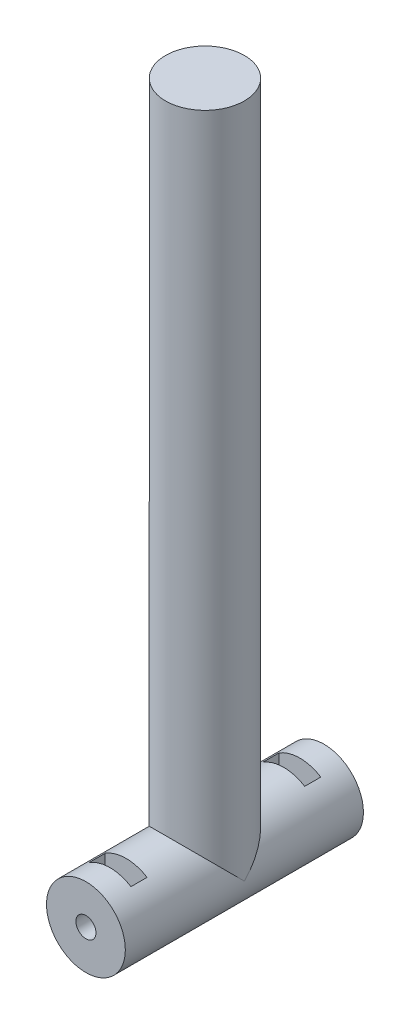
ISO-10303-21;
HEADER;
FILE_DESCRIPTION(('STEP AP214'),'2;1');
FILE_NAME('part.step','',(''),(''),'','','');
FILE_SCHEMA(('AUTOMOTIVE_DESIGN { 1 0 10303 214 1 1 1 1 }'));
ENDSEC;
DATA;
#1=APPLICATION_CONTEXT('core data for automotive mechanical design processes');
#2=APPLICATION_PROTOCOL_DEFINITION('international standard','automotive_design',2000,#1);
#3=PRODUCT_CONTEXT('',#1,'mechanical');
#4=PRODUCT('Part','Part','',(#3));
#5=PRODUCT_RELATED_PRODUCT_CATEGORY('part','',(#4));
#6=PRODUCT_DEFINITION_FORMATION('','',#4);
#7=PRODUCT_DEFINITION_CONTEXT('part definition',#1,'design');
#8=PRODUCT_DEFINITION('design','',#6,#7);
#9=PRODUCT_DEFINITION_SHAPE('','',#8);
#10=(LENGTH_UNIT() NAMED_UNIT(*) SI_UNIT(.MILLI.,.METRE.));
#11=(NAMED_UNIT(*) PLANE_ANGLE_UNIT() SI_UNIT($,.RADIAN.));
#12=(NAMED_UNIT(*) SI_UNIT($,.STERADIAN.) SOLID_ANGLE_UNIT());
#13=UNCERTAINTY_MEASURE_WITH_UNIT(LENGTH_MEASURE(1.E-05),#10,'distance_accuracy_value','');
#14=(GEOMETRIC_REPRESENTATION_CONTEXT(3) GLOBAL_UNCERTAINTY_ASSIGNED_CONTEXT((#13)) GLOBAL_UNIT_ASSIGNED_CONTEXT((#10,
#11,#12)) REPRESENTATION_CONTEXT('',''));
#15=CARTESIAN_POINT('',(0.,0.,0.));
#16=DIRECTION('',(0.,0.,1.));
#17=DIRECTION('',(1.,0.,0.));
#18=AXIS2_PLACEMENT_3D('',#15,#16,#17);
#19=CARTESIAN_POINT('',(1.29903810567666,-2.25,-9.8));
#20=DIRECTION('',(-0.866025403784439,0.5,0.));
#21=DIRECTION('',(-0.5,-0.866025403784439,0.));
#22=AXIS2_PLACEMENT_3D('',#19,#20,#21);
#23=PLANE('',#22);
#24=DIRECTION('',(0.5,0.866025403784439,0.));
#25=VECTOR('',#24,1.);
#26=CARTESIAN_POINT('',(1.29903810567666,-2.25,-11.8));
#27=LINE('',#26,#25);
#28=CARTESIAN_POINT('',(1.29903810567666,-2.25,-11.8));
#29=VERTEX_POINT('',#28);
#30=CARTESIAN_POINT('',(2.59807621135332,0.,-11.8));
#31=VERTEX_POINT('',#30);
#32=EDGE_CURVE('E172',#29,#31,#27,.T.);
#33=ORIENTED_EDGE('',*,*,#32,.F.);
#34=DIRECTION('',(0.,0.,-1.));
#35=VECTOR('',#34,1.);
#36=CARTESIAN_POINT('',(1.29903810567666,-2.25,-9.8));
#37=LINE('',#36,#35);
#38=CARTESIAN_POINT('',(1.29903810567666,-2.25,-9.8));
#39=VERTEX_POINT('',#38);
#40=EDGE_CURVE('E160',#39,#29,#37,.T.);
#41=ORIENTED_EDGE('',*,*,#40,.F.);
#42=DIRECTION('',(0.5,0.866025403784439,0.));
#43=VECTOR('',#42,1.);
#44=CARTESIAN_POINT('',(1.29903810567666,-2.25,-9.8));
#45=LINE('',#44,#43);
#46=CARTESIAN_POINT('',(2.59807621135332,0.,-9.8));
#47=VERTEX_POINT('',#46);
#48=EDGE_CURVE('E139',#39,#47,#45,.T.);
#49=ORIENTED_EDGE('',*,*,#48,.T.);
#50=DIRECTION('',(0.,0.,-1.));
#51=VECTOR('',#50,1.);
#52=CARTESIAN_POINT('',(2.59807621135332,0.,-9.8));
#53=LINE('',#52,#51);
#54=EDGE_CURVE('E149',#47,#31,#53,.T.);
#55=ORIENTED_EDGE('',*,*,#54,.T.);
#56=EDGE_LOOP('',(#33,#41,#49,#55));
#57=FACE_BOUND('',#56,.T.);
#58=ADVANCED_FACE('F39',(#57),#23,.T.);
#59=CARTESIAN_POINT('',(-2.59807621135332,0.,-9.8));
#60=DIRECTION('',(0.866025403784439,0.5,0.));
#61=DIRECTION('',(-0.5,0.866025403784439,0.));
#62=AXIS2_PLACEMENT_3D('',#59,#60,#61);
#63=PLANE('',#62);
#64=DIRECTION('',(0.5,-0.866025403784439,0.));
#65=VECTOR('',#64,1.);
#66=CARTESIAN_POINT('',(-2.59807621135332,0.,-11.8));
#67=LINE('',#66,#65);
#68=CARTESIAN_POINT('',(-2.59807621135332,0.,-11.8));
#69=VERTEX_POINT('',#68);
#70=CARTESIAN_POINT('',(-1.29903810567666,-2.25,-11.8));
#71=VERTEX_POINT('',#70);
#72=EDGE_CURVE('E162',#69,#71,#67,.T.);
#73=ORIENTED_EDGE('',*,*,#72,.F.);
#74=DIRECTION('',(0.,0.,-1.));
#75=VECTOR('',#74,1.);
#76=CARTESIAN_POINT('',(-2.59807621135332,0.,-9.8));
#77=LINE('',#76,#75);
#78=CARTESIAN_POINT('',(-2.59807621135332,0.,-9.8));
#79=VERTEX_POINT('',#78);
#80=EDGE_CURVE('E156',#79,#69,#77,.T.);
#81=ORIENTED_EDGE('',*,*,#80,.F.);
#82=DIRECTION('',(0.5,-0.866025403784439,0.));
#83=VECTOR('',#82,1.);
#84=CARTESIAN_POINT('',(-2.59807621135332,0.,-9.8));
#85=LINE('',#84,#83);
#86=CARTESIAN_POINT('',(-1.29903810567666,-2.25,-9.8));
#87=VERTEX_POINT('',#86);
#88=EDGE_CURVE('E164',#79,#87,#85,.T.);
#89=ORIENTED_EDGE('',*,*,#88,.T.);
#90=DIRECTION('',(0.,0.,-1.));
#91=VECTOR('',#90,1.);
#92=CARTESIAN_POINT('',(-1.29903810567666,-2.25,-9.8));
#93=LINE('',#92,#91);
#94=EDGE_CURVE('E176',#87,#71,#93,.T.);
#95=ORIENTED_EDGE('',*,*,#94,.T.);
#96=EDGE_LOOP('',(#73,#81,#89,#95));
#97=FACE_BOUND('',#96,.T.);
#98=ADVANCED_FACE('F256',(#97),#63,.T.);
#99=CARTESIAN_POINT('',(-1.29903810567666,-2.25,-9.8));
#100=DIRECTION('',(0.,1.,0.));
#101=DIRECTION('',(0.,0.,1.));
#102=AXIS2_PLACEMENT_3D('',#99,#100,#101);
#103=PLANE('',#102);
#104=DIRECTION('',(1.,0.,0.));
#105=VECTOR('',#104,1.);
#106=CARTESIAN_POINT('',(-1.29903810567666,-2.25,-11.8));
#107=LINE('',#106,#105);
#108=EDGE_CURVE('E166',#71,#29,#107,.T.);
#109=ORIENTED_EDGE('',*,*,#108,.F.);
#110=ORIENTED_EDGE('',*,*,#94,.F.);
#111=DIRECTION('',(1.,0.,0.));
#112=VECTOR('',#111,1.);
#113=CARTESIAN_POINT('',(-1.29903810567666,-2.25,-9.8));
#114=LINE('',#113,#112);
#115=EDGE_CURVE('E161',#87,#39,#114,.T.);
#116=ORIENTED_EDGE('',*,*,#115,.T.);
#117=ORIENTED_EDGE('',*,*,#40,.T.);
#118=EDGE_LOOP('',(#109,#110,#116,#117));
#119=FACE_BOUND('',#118,.T.);
#120=ADVANCED_FACE('F261',(#119),#103,.T.);
#121=CARTESIAN_POINT('',(0.,0.,-9.8));
#122=DIRECTION('',(0.,0.,-1.));
#123=DIRECTION('',(1.,0.,0.));
#124=AXIS2_PLACEMENT_3D('',#121,#122,#123);
#125=PLANE('',#124);
#126=CARTESIAN_POINT('',(0.,0.,-9.8));
#127=DIRECTION('',(0.,0.,-1.));
#128=DIRECTION('',(-1.,0.,0.));
#129=AXIS2_PLACEMENT_3D('',#126,#127,#128);
#130=CIRCLE('',#129,1.25);
#131=CARTESIAN_POINT('',(-1.25,0.,-9.8));
#132=VERTEX_POINT('',#131);
#133=EDGE_CURVE('E351',#132,#132,#130,.T.);
#134=ORIENTED_EDGE('',*,*,#133,.F.);
#135=EDGE_LOOP('',(#134));
#136=FACE_BOUND('',#135,.T.);
#137=DIRECTION('',(0.,-1.,0.));
#138=VECTOR('',#137,1.);
#139=CARTESIAN_POINT('',(2.59807621135332,12.,-9.8));
#140=LINE('',#139,#138);
#141=CARTESIAN_POINT('',(2.59807621135332,4.1545156155682,-9.8));
#142=VERTEX_POINT('',#141);
#143=EDGE_CURVE('E134',#142,#47,#140,.T.);
#144=ORIENTED_EDGE('',*,*,#143,.T.);
#145=ORIENTED_EDGE('',*,*,#48,.F.);
#146=ORIENTED_EDGE('',*,*,#115,.F.);
#147=ORIENTED_EDGE('',*,*,#88,.F.);
#148=DIRECTION('',(0.,-1.,0.));
#149=VECTOR('',#148,1.);
#150=CARTESIAN_POINT('',(-2.59807621135332,12.,-9.8));
#151=LINE('',#150,#149);
#152=CARTESIAN_POINT('',(-2.59807621135332,4.1545156155682,-9.8));
#153=VERTEX_POINT('',#152);
#154=EDGE_CURVE('E354',#153,#79,#151,.T.);
#155=ORIENTED_EDGE('',*,*,#154,.F.);
#156=CARTESIAN_POINT('',(0.,0.,-9.8));
#157=DIRECTION('',(0.,0.,1.));
#158=DIRECTION('',(1.,0.,0.));
#159=AXIS2_PLACEMENT_3D('',#156,#157,#158);
#160=CIRCLE('',#159,4.9);
#161=EDGE_CURVE('E142',#153,#142,#160,.F.);
#162=ORIENTED_EDGE('',*,*,#161,.T.);
#163=EDGE_LOOP('',(#144,#145,#146,#147,#155,#162));
#164=FACE_BOUND('',#163,.T.);
#165=ADVANCED_FACE('F136',(#136,#164),#125,.T.);
#166=CARTESIAN_POINT('',(0.,0.,-11.8));
#167=DIRECTION('',(0.,0.,-1.));
#168=DIRECTION('',(1.,0.,0.));
#169=AXIS2_PLACEMENT_3D('',#166,#167,#168);
#170=PLANE('',#169);
#171=CARTESIAN_POINT('',(0.,0.,-11.8));
#172=DIRECTION('',(0.,0.,-1.));
#173=DIRECTION('',(-1.,0.,0.));
#174=AXIS2_PLACEMENT_3D('',#171,#172,#173);
#175=CIRCLE('',#174,1.25);
#176=CARTESIAN_POINT('',(-1.25,0.,-11.8));
#177=VERTEX_POINT('',#176);
#178=EDGE_CURVE('E346',#177,#177,#175,.T.);
#179=ORIENTED_EDGE('',*,*,#178,.T.);
#180=EDGE_LOOP('',(#179));
#181=FACE_BOUND('',#180,.T.);
#182=ORIENTED_EDGE('',*,*,#32,.T.);
#183=DIRECTION('',(0.,-1.,0.));
#184=VECTOR('',#183,1.);
#185=CARTESIAN_POINT('',(2.59807621135332,12.,-11.8));
#186=LINE('',#185,#184);
#187=CARTESIAN_POINT('',(2.59807621135332,4.1545156155682,-11.8));
#188=VERTEX_POINT('',#187);
#189=EDGE_CURVE('E146',#188,#31,#186,.T.);
#190=ORIENTED_EDGE('',*,*,#189,.F.);
#191=CARTESIAN_POINT('',(0.,0.,-11.8));
#192=DIRECTION('',(0.,0.,-1.));
#193=DIRECTION('',(-1.,0.,0.));
#194=AXIS2_PLACEMENT_3D('',#191,#192,#193);
#195=CIRCLE('',#194,4.9);
#196=CARTESIAN_POINT('',(-2.59807621135332,4.1545156155682,-11.8));
#197=VERTEX_POINT('',#196);
#198=EDGE_CURVE('E360',#188,#197,#195,.F.);
#199=ORIENTED_EDGE('',*,*,#198,.T.);
#200=DIRECTION('',(0.,-1.,0.));
#201=VECTOR('',#200,1.);
#202=CARTESIAN_POINT('',(-2.59807621135332,12.,-11.8));
#203=LINE('',#202,#201);
#204=EDGE_CURVE('E54',#197,#69,#203,.T.);
#205=ORIENTED_EDGE('',*,*,#204,.T.);
#206=ORIENTED_EDGE('',*,*,#72,.T.);
#207=ORIENTED_EDGE('',*,*,#108,.T.);
#208=EDGE_LOOP('',(#182,#190,#199,#205,#206,#207));
#209=FACE_BOUND('',#208,.T.);
#210=ADVANCED_FACE('F363',(#181,#209),#170,.F.);
#211=CARTESIAN_POINT('',(2.59807621135332,12.,-11.8));
#212=DIRECTION('',(1.,0.,0.));
#213=DIRECTION('',(0.,0.,-1.));
#214=AXIS2_PLACEMENT_3D('',#211,#212,#213);
#215=PLANE('',#214);
#216=DIRECTION('',(0.,0.,1.));
#217=VECTOR('',#216,1.);
#218=CARTESIAN_POINT('',(2.59807621135332,4.1545156155682,-14.8));
#219=LINE('',#218,#217);
#220=EDGE_CURVE('E359',#142,#188,#219,.F.);
#221=ORIENTED_EDGE('',*,*,#220,.T.);
#222=ORIENTED_EDGE('',*,*,#189,.T.);
#223=ORIENTED_EDGE('',*,*,#54,.F.);
#224=ORIENTED_EDGE('',*,*,#143,.F.);
#225=EDGE_LOOP('',(#221,#222,#223,#224));
#226=FACE_BOUND('',#225,.T.);
#227=ADVANCED_FACE('F150',(#226),#215,.F.);
#228=CARTESIAN_POINT('',(-2.59807621135332,12.,-9.8));
#229=DIRECTION('',(-1.,0.,0.));
#230=DIRECTION('',(0.,0.,1.));
#231=AXIS2_PLACEMENT_3D('',#228,#229,#230);
#232=PLANE('',#231);
#233=DIRECTION('',(0.,0.,1.));
#234=VECTOR('',#233,1.);
#235=CARTESIAN_POINT('',(-2.59807621135332,4.1545156155682,-14.8));
#236=LINE('',#235,#234);
#237=EDGE_CURVE('E145',#197,#153,#236,.T.);
#238=ORIENTED_EDGE('',*,*,#237,.T.);
#239=ORIENTED_EDGE('',*,*,#154,.T.);
#240=ORIENTED_EDGE('',*,*,#80,.T.);
#241=ORIENTED_EDGE('',*,*,#204,.F.);
#242=EDGE_LOOP('',(#238,#239,#240,#241));
#243=FACE_BOUND('',#242,.T.);
#244=ADVANCED_FACE('F290',(#243),#232,.F.);
#245=CARTESIAN_POINT('',(1.29903810567666,-2.25,9.8));
#246=DIRECTION('',(0.866025403784439,-0.5,0.));
#247=DIRECTION('',(0.5,0.866025403784439,0.));
#248=AXIS2_PLACEMENT_3D('',#245,#246,#247);
#249=PLANE('',#248);
#250=DIRECTION('',(0.5,0.866025403784439,0.));
#251=VECTOR('',#250,1.);
#252=CARTESIAN_POINT('',(1.29903810567666,-2.25,11.8));
#253=LINE('',#252,#251);
#254=CARTESIAN_POINT('',(1.29903810567666,-2.25,11.8));
#255=VERTEX_POINT('',#254);
#256=CARTESIAN_POINT('',(2.59807621135332,0.,11.8));
#257=VERTEX_POINT('',#256);
#258=EDGE_CURVE('E198',#255,#257,#253,.T.);
#259=ORIENTED_EDGE('',*,*,#258,.T.);
#260=DIRECTION('',(0.,0.,1.));
#261=VECTOR('',#260,1.);
#262=CARTESIAN_POINT('',(2.59807621135332,0.,9.8));
#263=LINE('',#262,#261);
#264=CARTESIAN_POINT('',(2.59807621135332,0.,9.8));
#265=VERTEX_POINT('',#264);
#266=EDGE_CURVE('E209',#265,#257,#263,.T.);
#267=ORIENTED_EDGE('',*,*,#266,.F.);
#268=DIRECTION('',(0.5,0.866025403784439,0.));
#269=VECTOR('',#268,1.);
#270=CARTESIAN_POINT('',(1.29903810567666,-2.25,9.8));
#271=LINE('',#270,#269);
#272=CARTESIAN_POINT('',(1.29903810567666,-2.25,9.8));
#273=VERTEX_POINT('',#272);
#274=EDGE_CURVE('E199',#273,#265,#271,.T.);
#275=ORIENTED_EDGE('',*,*,#274,.F.);
#276=DIRECTION('',(0.,0.,1.));
#277=VECTOR('',#276,1.);
#278=CARTESIAN_POINT('',(1.29903810567666,-2.25,9.8));
#279=LINE('',#278,#277);
#280=EDGE_CURVE('E217',#273,#255,#279,.T.);
#281=ORIENTED_EDGE('',*,*,#280,.T.);
#282=EDGE_LOOP('',(#259,#267,#275,#281));
#283=FACE_BOUND('',#282,.T.);
#284=ADVANCED_FACE('F285',(#283),#249,.F.);
#285=CARTESIAN_POINT('',(-1.29903810567666,-2.25,9.8));
#286=DIRECTION('',(0.,-1.,0.));
#287=DIRECTION('',(0.,0.,-1.));
#288=AXIS2_PLACEMENT_3D('',#285,#286,#287);
#289=PLANE('',#288);
#290=DIRECTION('',(1.,0.,0.));
#291=VECTOR('',#290,1.);
#292=CARTESIAN_POINT('',(-1.29903810567666,-2.25,11.8));
#293=LINE('',#292,#291);
#294=CARTESIAN_POINT('',(-1.29903810567666,-2.25,11.8));
#295=VERTEX_POINT('',#294);
#296=EDGE_CURVE('E203',#295,#255,#293,.T.);
#297=ORIENTED_EDGE('',*,*,#296,.T.);
#298=ORIENTED_EDGE('',*,*,#280,.F.);
#299=DIRECTION('',(1.,0.,0.));
#300=VECTOR('',#299,1.);
#301=CARTESIAN_POINT('',(-1.29903810567666,-2.25,9.8));
#302=LINE('',#301,#300);
#303=CARTESIAN_POINT('',(-1.29903810567666,-2.25,9.8));
#304=VERTEX_POINT('',#303);
#305=EDGE_CURVE('E206',#304,#273,#302,.T.);
#306=ORIENTED_EDGE('',*,*,#305,.F.);
#307=DIRECTION('',(0.,0.,1.));
#308=VECTOR('',#307,1.);
#309=CARTESIAN_POINT('',(-1.29903810567666,-2.25,9.8));
#310=LINE('',#309,#308);
#311=EDGE_CURVE('E220',#304,#295,#310,.T.);
#312=ORIENTED_EDGE('',*,*,#311,.T.);
#313=EDGE_LOOP('',(#297,#298,#306,#312));
#314=FACE_BOUND('',#313,.T.);
#315=ADVANCED_FACE('F282',(#314),#289,.F.);
#316=CARTESIAN_POINT('',(-2.59807621135332,0.,9.8));
#317=DIRECTION('',(-0.866025403784439,-0.5,0.));
#318=DIRECTION('',(0.5,-0.866025403784439,0.));
#319=AXIS2_PLACEMENT_3D('',#316,#317,#318);
#320=PLANE('',#319);
#321=DIRECTION('',(0.5,-0.866025403784439,0.));
#322=VECTOR('',#321,1.);
#323=CARTESIAN_POINT('',(-2.59807621135332,0.,11.8));
#324=LINE('',#323,#322);
#325=CARTESIAN_POINT('',(-2.59807621135332,0.,11.8));
#326=VERTEX_POINT('',#325);
#327=EDGE_CURVE('E212',#326,#295,#324,.T.);
#328=ORIENTED_EDGE('',*,*,#327,.T.);
#329=ORIENTED_EDGE('',*,*,#311,.F.);
#330=DIRECTION('',(0.5,-0.866025403784439,0.));
#331=VECTOR('',#330,1.);
#332=CARTESIAN_POINT('',(-2.59807621135332,0.,9.8));
#333=LINE('',#332,#331);
#334=CARTESIAN_POINT('',(-2.59807621135332,0.,9.8));
#335=VERTEX_POINT('',#334);
#336=EDGE_CURVE('E202',#335,#304,#333,.T.);
#337=ORIENTED_EDGE('',*,*,#336,.F.);
#338=DIRECTION('',(0.,0.,1.));
#339=VECTOR('',#338,1.);
#340=CARTESIAN_POINT('',(-2.59807621135332,0.,9.8));
#341=LINE('',#340,#339);
#342=EDGE_CURVE('E222',#335,#326,#341,.T.);
#343=ORIENTED_EDGE('',*,*,#342,.T.);
#344=EDGE_LOOP('',(#328,#329,#337,#343));
#345=FACE_BOUND('',#344,.T.);
#346=ADVANCED_FACE('F277',(#345),#320,.F.);
#347=CARTESIAN_POINT('',(0.,0.,9.8));
#348=DIRECTION('',(0.,0.,1.));
#349=DIRECTION('',(1.,0.,0.));
#350=AXIS2_PLACEMENT_3D('',#347,#348,#349);
#351=PLANE('',#350);
#352=CARTESIAN_POINT('',(0.,0.,9.8));
#353=DIRECTION('',(0.,0.,1.));
#354=DIRECTION('',(1.,0.,0.));
#355=AXIS2_PLACEMENT_3D('',#352,#353,#354);
#356=CIRCLE('',#355,1.25);
#357=CARTESIAN_POINT('',(1.25,0.,9.8));
#358=VERTEX_POINT('',#357);
#359=EDGE_CURVE('E339',#358,#358,#356,.F.);
#360=ORIENTED_EDGE('',*,*,#359,.T.);
#361=EDGE_LOOP('',(#360));
#362=FACE_BOUND('',#361,.T.);
#363=DIRECTION('',(0.,-1.,0.));
#364=VECTOR('',#363,1.);
#365=CARTESIAN_POINT('',(-2.59807621135332,12.,9.8));
#366=LINE('',#365,#364);
#367=CARTESIAN_POINT('',(-2.59807621135332,4.1545156155682,9.8));
#368=VERTEX_POINT('',#367);
#369=EDGE_CURVE('E184',#368,#335,#366,.T.);
#370=ORIENTED_EDGE('',*,*,#369,.T.);
#371=ORIENTED_EDGE('',*,*,#336,.T.);
#372=ORIENTED_EDGE('',*,*,#305,.T.);
#373=ORIENTED_EDGE('',*,*,#274,.T.);
#374=DIRECTION('',(0.,-1.,0.));
#375=VECTOR('',#374,1.);
#376=CARTESIAN_POINT('',(2.59807621135332,12.,9.8));
#377=LINE('',#376,#375);
#378=CARTESIAN_POINT('',(2.59807621135332,4.1545156155682,9.8));
#379=VERTEX_POINT('',#378);
#380=EDGE_CURVE('E155',#379,#265,#377,.T.);
#381=ORIENTED_EDGE('',*,*,#380,.F.);
#382=CARTESIAN_POINT('',(0.,0.,9.8));
#383=DIRECTION('',(0.,0.,1.));
#384=DIRECTION('',(1.,0.,0.));
#385=AXIS2_PLACEMENT_3D('',#382,#383,#384);
#386=CIRCLE('',#385,4.9);
#387=EDGE_CURVE('E195',#368,#379,#386,.F.);
#388=ORIENTED_EDGE('',*,*,#387,.F.);
#389=EDGE_LOOP('',(#370,#371,#372,#373,#381,#388));
#390=FACE_BOUND('',#389,.T.);
#391=ADVANCED_FACE('F274',(#362,#390),#351,.T.);
#392=CARTESIAN_POINT('',(0.,0.,11.8));
#393=DIRECTION('',(0.,0.,1.));
#394=DIRECTION('',(1.,0.,0.));
#395=AXIS2_PLACEMENT_3D('',#392,#393,#394);
#396=PLANE('',#395);
#397=CARTESIAN_POINT('',(0.,0.,11.8));
#398=DIRECTION('',(0.,0.,1.));
#399=DIRECTION('',(1.,0.,0.));
#400=AXIS2_PLACEMENT_3D('',#397,#398,#399);
#401=CIRCLE('',#400,1.25);
#402=CARTESIAN_POINT('',(1.25,0.,11.8));
#403=VERTEX_POINT('',#402);
#404=EDGE_CURVE('E334',#403,#403,#401,.F.);
#405=ORIENTED_EDGE('',*,*,#404,.F.);
#406=EDGE_LOOP('',(#405));
#407=FACE_BOUND('',#406,.T.);
#408=ORIENTED_EDGE('',*,*,#327,.F.);
#409=DIRECTION('',(0.,-1.,0.));
#410=VECTOR('',#409,1.);
#411=CARTESIAN_POINT('',(-2.59807621135332,12.,11.8));
#412=LINE('',#411,#410);
#413=CARTESIAN_POINT('',(-2.59807621135332,4.1545156155682,11.8));
#414=VERTEX_POINT('',#413);
#415=EDGE_CURVE('E182',#414,#326,#412,.T.);
#416=ORIENTED_EDGE('',*,*,#415,.F.);
#417=CARTESIAN_POINT('',(0.,0.,11.8));
#418=DIRECTION('',(0.,0.,-1.));
#419=DIRECTION('',(-1.,0.,0.));
#420=AXIS2_PLACEMENT_3D('',#417,#418,#419);
#421=CIRCLE('',#420,4.9);
#422=CARTESIAN_POINT('',(2.59807621135332,4.1545156155682,11.8));
#423=VERTEX_POINT('',#422);
#424=EDGE_CURVE('E192',#423,#414,#421,.F.);
#425=ORIENTED_EDGE('',*,*,#424,.F.);
#426=DIRECTION('',(0.,-1.,0.));
#427=VECTOR('',#426,1.);
#428=CARTESIAN_POINT('',(2.59807621135332,12.,11.8));
#429=LINE('',#428,#427);
#430=EDGE_CURVE('E62',#423,#257,#429,.T.);
#431=ORIENTED_EDGE('',*,*,#430,.T.);
#432=ORIENTED_EDGE('',*,*,#258,.F.);
#433=ORIENTED_EDGE('',*,*,#296,.F.);
#434=EDGE_LOOP('',(#408,#416,#425,#431,#432,#433));
#435=FACE_BOUND('',#434,.T.);
#436=ADVANCED_FACE('F272',(#407,#435),#396,.F.);
#437=CARTESIAN_POINT('',(-2.59807621135332,12.,9.8));
#438=DIRECTION('',(1.,0.,0.));
#439=DIRECTION('',(0.,0.,-1.));
#440=AXIS2_PLACEMENT_3D('',#437,#438,#439);
#441=PLANE('',#440);
#442=ORIENTED_EDGE('',*,*,#415,.T.);
#443=ORIENTED_EDGE('',*,*,#342,.F.);
#444=ORIENTED_EDGE('',*,*,#369,.F.);
#445=DIRECTION('',(0.,0.,1.));
#446=VECTOR('',#445,1.);
#447=CARTESIAN_POINT('',(-2.59807621135332,4.1545156155682,-14.8));
#448=LINE('',#447,#446);
#449=EDGE_CURVE('E189',#414,#368,#448,.F.);
#450=ORIENTED_EDGE('',*,*,#449,.F.);
#451=EDGE_LOOP('',(#442,#443,#444,#450));
#452=FACE_BOUND('',#451,.T.);
#453=ADVANCED_FACE('F269',(#452),#441,.T.);
#454=CARTESIAN_POINT('',(2.59807621135332,12.,11.8));
#455=DIRECTION('',(-1.,0.,0.));
#456=DIRECTION('',(0.,0.,1.));
#457=AXIS2_PLACEMENT_3D('',#454,#455,#456);
#458=PLANE('',#457);
#459=ORIENTED_EDGE('',*,*,#380,.T.);
#460=ORIENTED_EDGE('',*,*,#266,.T.);
#461=ORIENTED_EDGE('',*,*,#430,.F.);
#462=DIRECTION('',(0.,0.,1.));
#463=VECTOR('',#462,1.);
#464=CARTESIAN_POINT('',(2.59807621135332,4.1545156155682,-14.8));
#465=LINE('',#464,#463);
#466=EDGE_CURVE('E186',#379,#423,#465,.T.);
#467=ORIENTED_EDGE('',*,*,#466,.F.);
#468=EDGE_LOOP('',(#459,#460,#461,#467));
#469=FACE_BOUND('',#468,.T.);
#470=ADVANCED_FACE('F266',(#469),#458,.T.);
#471=CARTESIAN_POINT('',(0.,0.,-14.8));
#472=DIRECTION('',(0.,0.,1.));
#473=DIRECTION('',(1.,0.,0.));
#474=AXIS2_PLACEMENT_3D('',#471,#472,#473);
#475=CYLINDRICAL_SURFACE('',#474,4.9);
#476=ORIENTED_EDGE('',*,*,#161,.F.);
#477=ORIENTED_EDGE('',*,*,#237,.F.);
#478=ORIENTED_EDGE('',*,*,#198,.F.);
#479=ORIENTED_EDGE('',*,*,#220,.F.);
#480=EDGE_LOOP('',(#476,#477,#478,#479));
#481=FACE_BOUND('',#480,.T.);
#482=CARTESIAN_POINT('',(0.,0.,-14.8));
#483=DIRECTION('',(0.,0.,1.));
#484=DIRECTION('',(1.,0.,0.));
#485=AXIS2_PLACEMENT_3D('',#482,#483,#484);
#486=CIRCLE('',#485,4.9);
#487=CARTESIAN_POINT('',(4.9,0.,-14.8));
#488=VERTEX_POINT('',#487);
#489=EDGE_CURVE('E231',#488,#488,#486,.T.);
#490=ORIENTED_EDGE('',*,*,#489,.T.);
#491=EDGE_LOOP('',(#490));
#492=FACE_BOUND('',#491,.T.);
#493=CARTESIAN_POINT('',(0.,0.,14.8));
#494=DIRECTION('',(0.,0.,1.));
#495=DIRECTION('',(1.,0.,0.));
#496=AXIS2_PLACEMENT_3D('',#493,#494,#495);
#497=CIRCLE('',#496,4.9);
#498=CARTESIAN_POINT('',(4.9,0.,14.8));
#499=VERTEX_POINT('',#498);
#500=EDGE_CURVE('E228',#499,#499,#497,.T.);
#501=ORIENTED_EDGE('',*,*,#500,.F.);
#502=EDGE_LOOP('',(#501));
#503=FACE_BOUND('',#502,.T.);
#504=CARTESIAN_POINT('',(0.,0.,0.));
#505=DIRECTION('',(0.,0.707106781186547,0.707106781186548));
#506=DIRECTION('',(0.,-0.707106781186547,0.707106781186548));
#507=AXIS2_PLACEMENT_3D('',#504,#505,#506);
#508=ELLIPSE('',#507,6.92964645562817,4.9);
#509=CARTESIAN_POINT('',(-4.9,0.,0.));
#510=VERTEX_POINT('',#509);
#511=CARTESIAN_POINT('',(4.9,0.,0.));
#512=VERTEX_POINT('',#511);
#513=EDGE_CURVE('E47',#510,#512,#508,.F.);
#514=ORIENTED_EDGE('',*,*,#513,.T.);
#515=CARTESIAN_POINT('',(0.,0.,0.));
#516=DIRECTION('',(0.,-0.707106781186547,0.707106781186548));
#517=DIRECTION('',(0.,0.707106781186547,0.707106781186548));
#518=AXIS2_PLACEMENT_3D('',#515,#516,#517);
#519=ELLIPSE('',#518,6.92964645562817,4.9);
#520=EDGE_CURVE('E11',#512,#510,#519,.T.);
#521=ORIENTED_EDGE('',*,*,#520,.T.);
#522=EDGE_LOOP('',(#514,#521));
#523=FACE_BOUND('',#522,.T.);
#524=ORIENTED_EDGE('',*,*,#449,.T.);
#525=ORIENTED_EDGE('',*,*,#387,.T.);
#526=ORIENTED_EDGE('',*,*,#466,.T.);
#527=ORIENTED_EDGE('',*,*,#424,.T.);
#528=EDGE_LOOP('',(#524,#525,#526,#527));
#529=FACE_BOUND('',#528,.T.);
#530=ADVANCED_FACE('F41',(#481,#492,#503,#523,#529),#475,.T.);
#531=CARTESIAN_POINT('',(0.,0.,-14.8));
#532=DIRECTION('',(0.,0.,1.));
#533=DIRECTION('',(1.,0.,0.));
#534=AXIS2_PLACEMENT_3D('',#531,#532,#533);
#535=PLANE('',#534);
#536=CARTESIAN_POINT('',(0.,0.,-14.8));
#537=DIRECTION('',(0.,0.,-1.));
#538=DIRECTION('',(-1.,0.,0.));
#539=AXIS2_PLACEMENT_3D('',#536,#537,#538);
#540=CIRCLE('',#539,1.25);
#541=CARTESIAN_POINT('',(-1.25,0.,-14.8));
#542=VERTEX_POINT('',#541);
#543=EDGE_CURVE('E342',#542,#542,#540,.T.);
#544=ORIENTED_EDGE('',*,*,#543,.F.);
#545=EDGE_LOOP('',(#544));
#546=FACE_BOUND('',#545,.T.);
#547=ORIENTED_EDGE('',*,*,#489,.F.);
#548=EDGE_LOOP('',(#547));
#549=FACE_BOUND('',#548,.T.);
#550=ADVANCED_FACE('F310',(#546,#549),#535,.F.);
#551=CARTESIAN_POINT('',(0.,0.,14.8));
#552=DIRECTION('',(0.,0.,1.));
#553=DIRECTION('',(1.,0.,0.));
#554=AXIS2_PLACEMENT_3D('',#551,#552,#553);
#555=PLANE('',#554);
#556=CARTESIAN_POINT('',(0.,0.,14.8));
#557=DIRECTION('',(0.,0.,-1.));
#558=DIRECTION('',(-1.,0.,0.));
#559=AXIS2_PLACEMENT_3D('',#556,#557,#558);
#560=CIRCLE('',#559,1.25);
#561=CARTESIAN_POINT('',(-1.25,0.,14.8));
#562=VERTEX_POINT('',#561);
#563=EDGE_CURVE('E329',#562,#562,#560,.T.);
#564=ORIENTED_EDGE('',*,*,#563,.T.);
#565=EDGE_LOOP('',(#564));
#566=FACE_BOUND('',#565,.T.);
#567=ORIENTED_EDGE('',*,*,#500,.T.);
#568=EDGE_LOOP('',(#567));
#569=FACE_BOUND('',#568,.T.);
#570=ADVANCED_FACE('F241',(#566,#569),#555,.T.);
#571=CARTESIAN_POINT('',(0.,84.,0.));
#572=DIRECTION('',(0.,-1.,0.));
#573=DIRECTION('',(0.,0.,-1.));
#574=AXIS2_PLACEMENT_3D('',#571,#572,#573);
#575=CYLINDRICAL_SURFACE('',#574,4.9);
#576=ORIENTED_EDGE('',*,*,#520,.F.);
#577=ORIENTED_EDGE('',*,*,#513,.F.);
#578=EDGE_LOOP('',(#576,#577));
#579=FACE_BOUND('',#578,.T.);
#580=CARTESIAN_POINT('',(0.,84.,0.));
#581=DIRECTION('',(0.,1.,0.));
#582=DIRECTION('',(0.,0.,1.));
#583=AXIS2_PLACEMENT_3D('',#580,#581,#582);
#584=CIRCLE('',#583,4.9);
#585=CARTESIAN_POINT('',(0.,84.,4.9));
#586=VERTEX_POINT('',#585);
#587=EDGE_CURVE('E219',#586,#586,#584,.T.);
#588=ORIENTED_EDGE('',*,*,#587,.F.);
#589=EDGE_LOOP('',(#588));
#590=FACE_BOUND('',#589,.T.);
#591=ADVANCED_FACE('F237',(#579,#590),#575,.T.);
#592=CARTESIAN_POINT('',(0.,84.,0.));
#593=DIRECTION('',(0.,1.,0.));
#594=DIRECTION('',(0.,0.,1.));
#595=AXIS2_PLACEMENT_3D('',#592,#593,#594);
#596=PLANE('',#595);
#597=ORIENTED_EDGE('',*,*,#587,.T.);
#598=EDGE_LOOP('',(#597));
#599=FACE_BOUND('',#598,.T.);
#600=ADVANCED_FACE('F240',(#599),#596,.T.);
#601=CARTESIAN_POINT('',(0.,0.,-4.8));
#602=DIRECTION('',(0.,0.,-1.));
#603=DIRECTION('',(-1.,0.,0.));
#604=AXIS2_PLACEMENT_3D('',#601,#602,#603);
#605=CYLINDRICAL_SURFACE('',#604,1.25);
#606=ORIENTED_EDGE('',*,*,#543,.T.);
#607=EDGE_LOOP('',(#606));
#608=FACE_BOUND('',#607,.T.);
#609=ORIENTED_EDGE('',*,*,#178,.F.);
#610=EDGE_LOOP('',(#609));
#611=FACE_BOUND('',#610,.T.);
#612=ADVANCED_FACE('F246',(#608,#611),#605,.F.);
#613=ORIENTED_EDGE('',*,*,#133,.T.);
#614=EDGE_LOOP('',(#613));
#615=FACE_BOUND('',#614,.T.);
#616=CARTESIAN_POINT('',(0.,0.,-4.8));
#617=DIRECTION('',(0.,0.,-1.));
#618=DIRECTION('',(-1.,0.,0.));
#619=AXIS2_PLACEMENT_3D('',#616,#617,#618);
#620=CIRCLE('',#619,1.25);
#621=CARTESIAN_POINT('',(-1.25,0.,-4.8));
#622=VERTEX_POINT('',#621);
#623=EDGE_CURVE('E343',#622,#622,#620,.T.);
#624=ORIENTED_EDGE('',*,*,#623,.F.);
#625=EDGE_LOOP('',(#624));
#626=FACE_BOUND('',#625,.T.);
#627=ADVANCED_FACE('F251',(#615,#626),#605,.F.);
#628=CARTESIAN_POINT('',(0.,0.,-4.8));
#629=DIRECTION('',(0.,0.,-1.));
#630=DIRECTION('',(-1.,0.,0.));
#631=AXIS2_PLACEMENT_3D('',#628,#629,#630);
#632=PLANE('',#631);
#633=ORIENTED_EDGE('',*,*,#623,.T.);
#634=EDGE_LOOP('',(#633));
#635=FACE_BOUND('',#634,.T.);
#636=ADVANCED_FACE('F386',(#635),#632,.T.);
#637=CARTESIAN_POINT('',(0.,0.,4.8));
#638=DIRECTION('',(0.,0.,1.));
#639=DIRECTION('',(1.,0.,0.));
#640=AXIS2_PLACEMENT_3D('',#637,#638,#639);
#641=CYLINDRICAL_SURFACE('',#640,1.25);
#642=ORIENTED_EDGE('',*,*,#563,.F.);
#643=EDGE_LOOP('',(#642));
#644=FACE_BOUND('',#643,.T.);
#645=ORIENTED_EDGE('',*,*,#404,.T.);
#646=EDGE_LOOP('',(#645));
#647=FACE_BOUND('',#646,.T.);
#648=ADVANCED_FACE('F390',(#644,#647),#641,.F.);
#649=ORIENTED_EDGE('',*,*,#359,.F.);
#650=EDGE_LOOP('',(#649));
#651=FACE_BOUND('',#650,.T.);
#652=CARTESIAN_POINT('',(0.,0.,4.8));
#653=DIRECTION('',(0.,0.,-1.));
#654=DIRECTION('',(-1.,0.,0.));
#655=AXIS2_PLACEMENT_3D('',#652,#653,#654);
#656=CIRCLE('',#655,1.25);
#657=CARTESIAN_POINT('',(-1.25,0.,4.8));
#658=VERTEX_POINT('',#657);
#659=EDGE_CURVE('E331',#658,#658,#656,.T.);
#660=ORIENTED_EDGE('',*,*,#659,.T.);
#661=EDGE_LOOP('',(#660));
#662=FACE_BOUND('',#661,.T.);
#663=ADVANCED_FACE('F392',(#651,#662),#641,.F.);
#664=CARTESIAN_POINT('',(0.,0.,4.8));
#665=DIRECTION('',(0.,0.,1.));
#666=DIRECTION('',(-1.,0.,0.));
#667=AXIS2_PLACEMENT_3D('',#664,#665,#666);
#668=PLANE('',#667);
#669=ORIENTED_EDGE('',*,*,#659,.F.);
#670=EDGE_LOOP('',(#669));
#671=FACE_BOUND('',#670,.T.);
#672=ADVANCED_FACE('F395',(#671),#668,.T.);
#673=CLOSED_SHELL('',(#58,#98,#120,#165,#210,#227,#244,#284,#315,#346,#391,#436,#453,#470,#530,
#550,#570,#591,#600,#612,#627,#636,#648,#663,#672));
#674=MANIFOLD_SOLID_BREP('B2',#673);
#675=ADVANCED_BREP_SHAPE_REPRESENTATION('',(#18,#674),#14);
#676=SHAPE_DEFINITION_REPRESENTATION(#9,#675);
ENDSEC;
END-ISO-10303-21;
